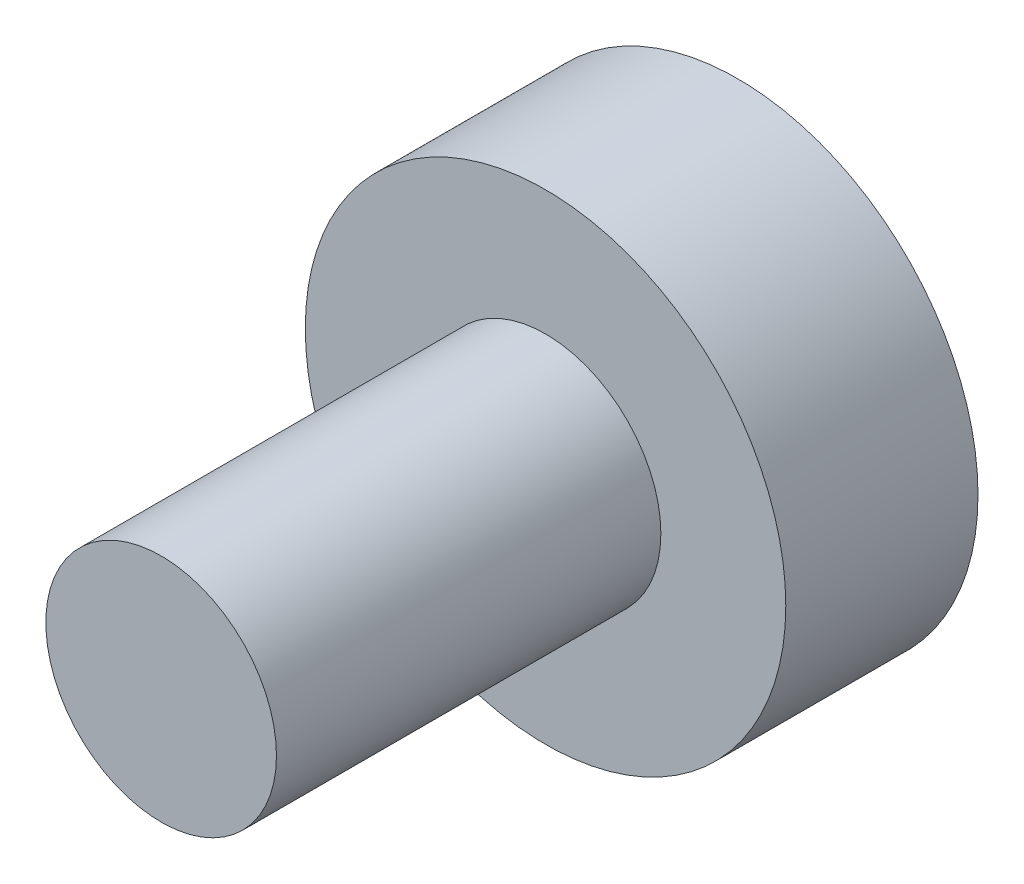
ISO-10303-21;
HEADER;
FILE_DESCRIPTION(('STEP AP214'),'2;1');
FILE_NAME('part.step','',(''),(''),'','','');
FILE_SCHEMA(('AUTOMOTIVE_DESIGN { 1 0 10303 214 1 1 1 1 }'));
ENDSEC;
DATA;
#1=APPLICATION_CONTEXT('core data for automotive mechanical design processes');
#2=APPLICATION_PROTOCOL_DEFINITION('international standard','automotive_design',2000,#1);
#3=PRODUCT_CONTEXT('',#1,'mechanical');
#4=PRODUCT('Part','Part','',(#3));
#5=PRODUCT_RELATED_PRODUCT_CATEGORY('part','',(#4));
#6=PRODUCT_DEFINITION_FORMATION('','',#4);
#7=PRODUCT_DEFINITION_CONTEXT('part definition',#1,'design');
#8=PRODUCT_DEFINITION('design','',#6,#7);
#9=PRODUCT_DEFINITION_SHAPE('','',#8);
#10=(LENGTH_UNIT() NAMED_UNIT(*) SI_UNIT(.MILLI.,.METRE.));
#11=(NAMED_UNIT(*) PLANE_ANGLE_UNIT() SI_UNIT($,.RADIAN.));
#12=(NAMED_UNIT(*) SI_UNIT($,.STERADIAN.) SOLID_ANGLE_UNIT());
#13=UNCERTAINTY_MEASURE_WITH_UNIT(LENGTH_MEASURE(1.E-05),#10,'distance_accuracy_value','');
#14=(GEOMETRIC_REPRESENTATION_CONTEXT(3) GLOBAL_UNCERTAINTY_ASSIGNED_CONTEXT((#13)) GLOBAL_UNIT_ASSIGNED_CONTEXT((#10,
#11,#12)) REPRESENTATION_CONTEXT('',''));
#15=CARTESIAN_POINT('',(0.,0.,0.));
#16=DIRECTION('',(0.,0.,1.));
#17=DIRECTION('',(1.,0.,0.));
#18=AXIS2_PLACEMENT_3D('',#15,#16,#17);
#19=CARTESIAN_POINT('',(0.,0.,6.));
#20=DIRECTION('',(0.,0.,1.));
#21=DIRECTION('',(1.,0.,0.));
#22=AXIS2_PLACEMENT_3D('',#19,#20,#21);
#23=PLANE('',#22);
#24=CARTESIAN_POINT('',(0.,0.,6.));
#25=DIRECTION('',(0.,0.,1.));
#26=DIRECTION('',(1.,0.,0.));
#27=AXIS2_PLACEMENT_3D('',#24,#25,#26);
#28=CIRCLE('',#27,1.8);
#29=CARTESIAN_POINT('',(1.8,0.,6.));
#30=VERTEX_POINT('',#29);
#31=EDGE_CURVE('E21',#30,#30,#28,.T.);
#32=ORIENTED_EDGE('',*,*,#31,.T.);
#33=EDGE_LOOP('',(#32));
#34=FACE_BOUND('',#33,.T.);
#35=ADVANCED_FACE('F17',(#34),#23,.T.);
#36=CARTESIAN_POINT('',(0.,0.,0.));
#37=DIRECTION('',(0.,0.,1.));
#38=DIRECTION('',(1.,0.,0.));
#39=AXIS2_PLACEMENT_3D('',#36,#37,#38);
#40=CYLINDRICAL_SURFACE('',#39,1.8);
#41=ORIENTED_EDGE('',*,*,#31,.F.);
#42=DIRECTION('',(0.,0.,1.));
#43=VECTOR('',#42,1.);
#44=CARTESIAN_POINT('',(1.8,0.,0.));
#45=LINE('',#44,#43);
#46=CARTESIAN_POINT('',(1.8,0.,0.));
#47=VERTEX_POINT('',#46);
#48=EDGE_CURVE('E11',#47,#30,#45,.T.);
#49=ORIENTED_EDGE('',*,*,#48,.F.);
#50=CARTESIAN_POINT('',(0.,0.,0.));
#51=DIRECTION('',(0.,0.,1.));
#52=DIRECTION('',(1.,0.,0.));
#53=AXIS2_PLACEMENT_3D('',#50,#51,#52);
#54=CIRCLE('',#53,1.8);
#55=EDGE_CURVE('E60',#47,#47,#54,.T.);
#56=ORIENTED_EDGE('',*,*,#55,.T.);
#57=ORIENTED_EDGE('',*,*,#48,.T.);
#58=EDGE_LOOP('',(#41,#49,#56,#57));
#59=FACE_BOUND('',#58,.T.);
#60=ADVANCED_FACE('F80',(#59),#40,.T.);
#61=CARTESIAN_POINT('',(0.,0.,-3.));
#62=DIRECTION('',(0.,0.,1.));
#63=DIRECTION('',(1.,0.,0.));
#64=AXIS2_PLACEMENT_3D('',#61,#62,#63);
#65=PLANE('',#64);
#66=CARTESIAN_POINT('',(0.,0.,-3.));
#67=DIRECTION('',(0.,0.,1.));
#68=DIRECTION('',(1.,0.,0.));
#69=AXIS2_PLACEMENT_3D('',#66,#67,#68);
#70=CIRCLE('',#69,3.75);
#71=CARTESIAN_POINT('',(3.75,0.,-3.));
#72=VERTEX_POINT('',#71);
#73=EDGE_CURVE('E56',#72,#72,#70,.T.);
#74=ORIENTED_EDGE('',*,*,#73,.F.);
#75=EDGE_LOOP('',(#74));
#76=FACE_BOUND('',#75,.T.);
#77=ADVANCED_FACE('F19',(#76),#65,.F.);
#78=CARTESIAN_POINT('',(0.,0.,0.));
#79=DIRECTION('',(0.,0.,1.));
#80=DIRECTION('',(1.,0.,0.));
#81=AXIS2_PLACEMENT_3D('',#78,#79,#80);
#82=PLANE('',#81);
#83=ORIENTED_EDGE('',*,*,#55,.F.);
#84=EDGE_LOOP('',(#83));
#85=FACE_BOUND('',#84,.T.);
#86=CARTESIAN_POINT('',(0.,0.,0.));
#87=DIRECTION('',(0.,0.,1.));
#88=DIRECTION('',(1.,0.,0.));
#89=AXIS2_PLACEMENT_3D('',#86,#87,#88);
#90=CIRCLE('',#89,3.75);
#91=CARTESIAN_POINT('',(3.75,0.,0.));
#92=VERTEX_POINT('',#91);
#93=EDGE_CURVE('E65',#92,#92,#90,.T.);
#94=ORIENTED_EDGE('',*,*,#93,.T.);
#95=EDGE_LOOP('',(#94));
#96=FACE_BOUND('',#95,.T.);
#97=ADVANCED_FACE('F71',(#85,#96),#82,.T.);
#98=CARTESIAN_POINT('',(0.,0.,-3.));
#99=DIRECTION('',(0.,0.,1.));
#100=DIRECTION('',(1.,0.,0.));
#101=AXIS2_PLACEMENT_3D('',#98,#99,#100);
#102=CYLINDRICAL_SURFACE('',#101,3.75);
#103=ORIENTED_EDGE('',*,*,#93,.F.);
#104=DIRECTION('',(0.,0.,1.));
#105=VECTOR('',#104,1.);
#106=CARTESIAN_POINT('',(3.75,0.,-3.));
#107=LINE('',#106,#105);
#108=EDGE_CURVE('E50',#72,#92,#107,.T.);
#109=ORIENTED_EDGE('',*,*,#108,.F.);
#110=ORIENTED_EDGE('',*,*,#73,.T.);
#111=ORIENTED_EDGE('',*,*,#108,.T.);
#112=EDGE_LOOP('',(#103,#109,#110,#111));
#113=FACE_BOUND('',#112,.T.);
#114=ADVANCED_FACE('F57',(#113),#102,.T.);
#115=CLOSED_SHELL('',(#35,#60,#77,#97,#114));
#116=MANIFOLD_SOLID_BREP('B1',#115);
#117=ADVANCED_BREP_SHAPE_REPRESENTATION('',(#18,#116),#14);
#118=SHAPE_DEFINITION_REPRESENTATION(#9,#117);
ENDSEC;
END-ISO-10303-21;
